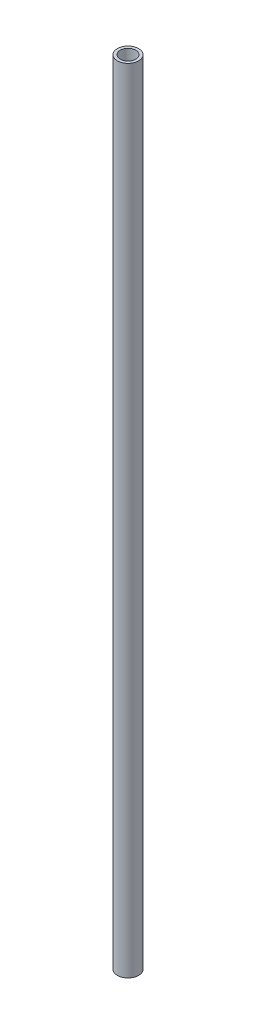
ISO-10303-21;
HEADER;
FILE_DESCRIPTION(('STEP AP214'),'2;1');
FILE_NAME('part.step','',(''),(''),'','','');
FILE_SCHEMA(('AUTOMOTIVE_DESIGN { 1 0 10303 214 1 1 1 1 }'));
ENDSEC;
DATA;
#1=APPLICATION_CONTEXT('core data for automotive mechanical design processes');
#2=APPLICATION_PROTOCOL_DEFINITION('international standard','automotive_design',2000,#1);
#3=PRODUCT_CONTEXT('',#1,'mechanical');
#4=PRODUCT('Part','Part','',(#3));
#5=PRODUCT_RELATED_PRODUCT_CATEGORY('part','',(#4));
#6=PRODUCT_DEFINITION_FORMATION('','',#4);
#7=PRODUCT_DEFINITION_CONTEXT('part definition',#1,'design');
#8=PRODUCT_DEFINITION('design','',#6,#7);
#9=PRODUCT_DEFINITION_SHAPE('','',#8);
#10=(LENGTH_UNIT() NAMED_UNIT(*) SI_UNIT(.MILLI.,.METRE.));
#11=(NAMED_UNIT(*) PLANE_ANGLE_UNIT() SI_UNIT($,.RADIAN.));
#12=(NAMED_UNIT(*) SI_UNIT($,.STERADIAN.) SOLID_ANGLE_UNIT());
#13=UNCERTAINTY_MEASURE_WITH_UNIT(LENGTH_MEASURE(1.E-05),#10,'distance_accuracy_value','');
#14=(GEOMETRIC_REPRESENTATION_CONTEXT(3) GLOBAL_UNCERTAINTY_ASSIGNED_CONTEXT((#13)) GLOBAL_UNIT_ASSIGNED_CONTEXT((#10,
#11,#12)) REPRESENTATION_CONTEXT('',''));
#15=CARTESIAN_POINT('',(0.,0.,0.));
#16=DIRECTION('',(0.,0.,1.));
#17=DIRECTION('',(1.,0.,0.));
#18=AXIS2_PLACEMENT_3D('',#15,#16,#17);
#19=CARTESIAN_POINT('',(0.,967.74,0.));
#20=DIRECTION('',(0.,1.,0.));
#21=DIRECTION('',(0.,0.,1.));
#22=AXIS2_PLACEMENT_3D('',#19,#20,#21);
#23=PLANE('',#22);
#24=CARTESIAN_POINT('',(0.,967.74,0.));
#25=DIRECTION('',(0.,1.,0.));
#26=DIRECTION('',(0.,0.,1.));
#27=AXIS2_PLACEMENT_3D('',#24,#25,#26);
#28=CIRCLE('',#27,13.);
#29=CARTESIAN_POINT('',(0.,967.74,13.));
#30=VERTEX_POINT('',#29);
#31=EDGE_CURVE('E10',#30,#30,#28,.T.);
#32=ORIENTED_EDGE('',*,*,#31,.T.);
#33=EDGE_LOOP('',(#32));
#34=FACE_BOUND('',#33,.T.);
#35=CARTESIAN_POINT('',(0.,967.74,0.));
#36=DIRECTION('',(0.,1.,0.));
#37=DIRECTION('',(0.,0.,1.));
#38=AXIS2_PLACEMENT_3D('',#35,#36,#37);
#39=CIRCLE('',#38,9.525);
#40=CARTESIAN_POINT('',(0.,967.74,9.525));
#41=VERTEX_POINT('',#40);
#42=EDGE_CURVE('E57',#41,#41,#39,.T.);
#43=ORIENTED_EDGE('',*,*,#42,.F.);
#44=EDGE_LOOP('',(#43));
#45=FACE_BOUND('',#44,.T.);
#46=ADVANCED_FACE('F43',(#34,#45),#23,.T.);
#47=CARTESIAN_POINT('',(0.,0.,0.));
#48=DIRECTION('',(0.,1.,0.));
#49=DIRECTION('',(0.,0.,1.));
#50=AXIS2_PLACEMENT_3D('',#47,#48,#49);
#51=PLANE('',#50);
#52=CARTESIAN_POINT('',(0.,0.,0.));
#53=DIRECTION('',(0.,1.,0.));
#54=DIRECTION('',(0.,0.,1.));
#55=AXIS2_PLACEMENT_3D('',#52,#53,#54);
#56=CIRCLE('',#55,13.);
#57=CARTESIAN_POINT('',(0.,0.,13.));
#58=VERTEX_POINT('',#57);
#59=EDGE_CURVE('E50',#58,#58,#56,.T.);
#60=ORIENTED_EDGE('',*,*,#59,.F.);
#61=EDGE_LOOP('',(#60));
#62=FACE_BOUND('',#61,.T.);
#63=CARTESIAN_POINT('',(0.,0.,0.));
#64=DIRECTION('',(0.,1.,0.));
#65=DIRECTION('',(0.,0.,1.));
#66=AXIS2_PLACEMENT_3D('',#63,#64,#65);
#67=CIRCLE('',#66,9.525);
#68=CARTESIAN_POINT('',(0.,0.,9.525));
#69=VERTEX_POINT('',#68);
#70=EDGE_CURVE('E59',#69,#69,#67,.T.);
#71=ORIENTED_EDGE('',*,*,#70,.T.);
#72=EDGE_LOOP('',(#71));
#73=FACE_BOUND('',#72,.T.);
#74=ADVANCED_FACE('F68',(#62,#73),#51,.F.);
#75=CARTESIAN_POINT('',(0.,967.74,0.));
#76=DIRECTION('',(0.,-1.,0.));
#77=DIRECTION('',(0.,0.,-1.));
#78=AXIS2_PLACEMENT_3D('',#75,#76,#77);
#79=CYLINDRICAL_SURFACE('',#78,13.);
#80=ORIENTED_EDGE('',*,*,#31,.F.);
#81=EDGE_LOOP('',(#80));
#82=FACE_BOUND('',#81,.T.);
#83=ORIENTED_EDGE('',*,*,#59,.T.);
#84=EDGE_LOOP('',(#83));
#85=FACE_BOUND('',#84,.T.);
#86=ADVANCED_FACE('F44',(#82,#85),#79,.T.);
#87=CARTESIAN_POINT('',(0.,967.74,0.));
#88=DIRECTION('',(0.,-1.,0.));
#89=DIRECTION('',(0.,0.,-1.));
#90=AXIS2_PLACEMENT_3D('',#87,#88,#89);
#91=CYLINDRICAL_SURFACE('',#90,9.525);
#92=ORIENTED_EDGE('',*,*,#42,.T.);
#93=EDGE_LOOP('',(#92));
#94=FACE_BOUND('',#93,.T.);
#95=ORIENTED_EDGE('',*,*,#70,.F.);
#96=EDGE_LOOP('',(#95));
#97=FACE_BOUND('',#96,.T.);
#98=ADVANCED_FACE('F67',(#94,#97),#91,.F.);
#99=CLOSED_SHELL('',(#46,#74,#86,#98));
#100=MANIFOLD_SOLID_BREP('B2',#99);
#101=ADVANCED_BREP_SHAPE_REPRESENTATION('',(#18,#100),#14);
#102=SHAPE_DEFINITION_REPRESENTATION(#9,#101);
ENDSEC;
END-ISO-10303-21;
